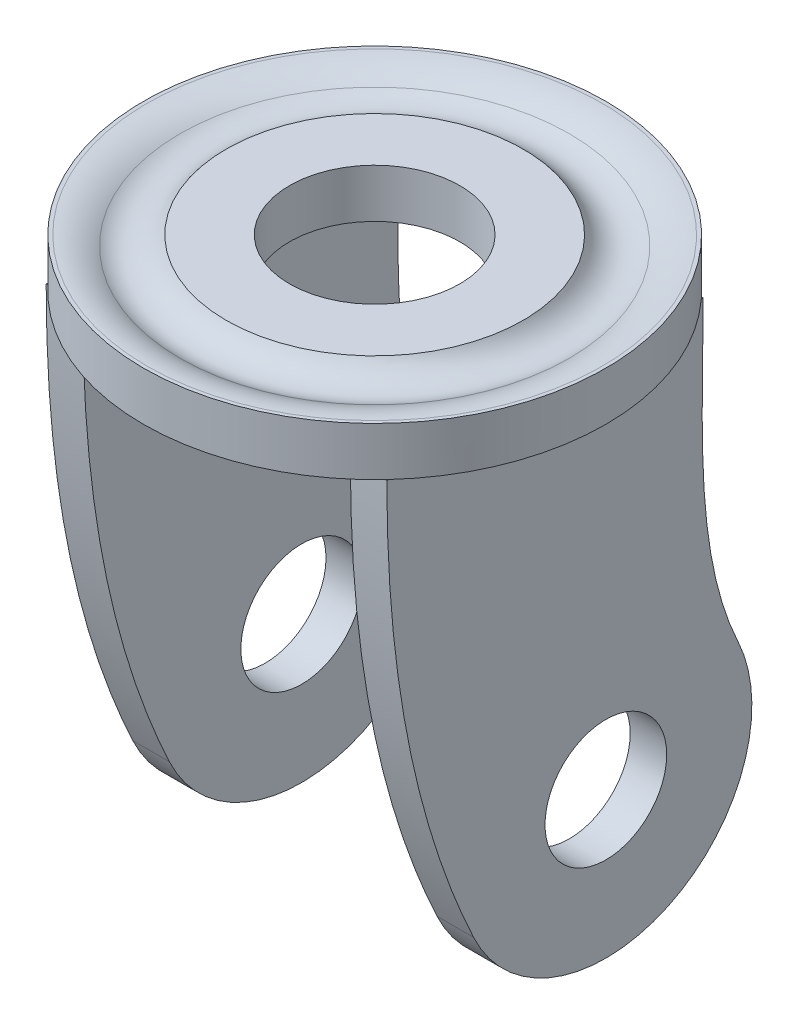
ISO-10303-21;
HEADER;
FILE_DESCRIPTION(('STEP AP214'),'2;1');
FILE_NAME('part.step','',(''),(''),'','','');
FILE_SCHEMA(('AUTOMOTIVE_DESIGN { 1 0 10303 214 1 1 1 1 }'));
ENDSEC;
DATA;
#1=APPLICATION_CONTEXT('core data for automotive mechanical design processes');
#2=APPLICATION_PROTOCOL_DEFINITION('international standard','automotive_design',2000,#1);
#3=PRODUCT_CONTEXT('',#1,'mechanical');
#4=PRODUCT('Part','Part','',(#3));
#5=PRODUCT_RELATED_PRODUCT_CATEGORY('part','',(#4));
#6=PRODUCT_DEFINITION_FORMATION('','',#4);
#7=PRODUCT_DEFINITION_CONTEXT('part definition',#1,'design');
#8=PRODUCT_DEFINITION('design','',#6,#7);
#9=PRODUCT_DEFINITION_SHAPE('','',#8);
#10=(LENGTH_UNIT() NAMED_UNIT(*) SI_UNIT(.MILLI.,.METRE.));
#11=(NAMED_UNIT(*) PLANE_ANGLE_UNIT() SI_UNIT($,.RADIAN.));
#12=(NAMED_UNIT(*) SI_UNIT($,.STERADIAN.) SOLID_ANGLE_UNIT());
#13=UNCERTAINTY_MEASURE_WITH_UNIT(LENGTH_MEASURE(1.E-05),#10,'distance_accuracy_value','');
#14=(GEOMETRIC_REPRESENTATION_CONTEXT(3) GLOBAL_UNCERTAINTY_ASSIGNED_CONTEXT((#13)) GLOBAL_UNIT_ASSIGNED_CONTEXT((#10,
#11,#12)) REPRESENTATION_CONTEXT('',''));
#15=CARTESIAN_POINT('',(0.,0.,0.));
#16=DIRECTION('',(0.,0.,1.));
#17=DIRECTION('',(1.,0.,0.));
#18=AXIS2_PLACEMENT_3D('',#15,#16,#17);
#19=CARTESIAN_POINT('',(-7.,0.,0.));
#20=DIRECTION('',(0.,-1.,0.));
#21=DIRECTION('',(0.,0.,-1.));
#22=AXIS2_PLACEMENT_3D('',#19,#20,#21);
#23=PLANE('',#22);
#24=CARTESIAN_POINT('',(0.,0.,0.));
#25=DIRECTION('',(0.,1.,0.));
#26=DIRECTION('',(0.,0.,1.));
#27=AXIS2_PLACEMENT_3D('',#24,#25,#26);
#28=CIRCLE('',#27,19.);
#29=CARTESIAN_POINT('',(14.,0.,12.8452325786651));
#30=VERTEX_POINT('',#29);
#31=CARTESIAN_POINT('',(14.,0.,-12.8452325786651));
#32=VERTEX_POINT('',#31);
#33=EDGE_CURVE('E362',#30,#32,#28,.T.);
#34=ORIENTED_EDGE('',*,*,#33,.F.);
#35=DIRECTION('',(0.,0.,1.));
#36=VECTOR('',#35,1.);
#37=CARTESIAN_POINT('',(14.,0.,-13.));
#38=LINE('',#37,#36);
#39=EDGE_CURVE('E508',#32,#30,#38,.T.);
#40=ORIENTED_EDGE('',*,*,#39,.F.);
#41=EDGE_LOOP('',(#34,#40));
#42=FACE_BOUND('',#41,.T.);
#43=ADVANCED_FACE('F39',(#42),#23,.T.);
#44=CARTESIAN_POINT('',(0.,0.,0.));
#45=DIRECTION('',(0.,1.,0.));
#46=DIRECTION('',(0.,0.,1.));
#47=AXIS2_PLACEMENT_3D('',#44,#45,#46);
#48=CIRCLE('',#47,7.);
#49=CARTESIAN_POINT('',(0.,0.,7.));
#50=VERTEX_POINT('',#49);
#51=EDGE_CURVE('E281',#50,#50,#48,.T.);
#52=ORIENTED_EDGE('',*,*,#51,.T.);
#53=EDGE_LOOP('',(#52));
#54=FACE_BOUND('',#53,.T.);
#55=CARTESIAN_POINT('',(13.856406460551,0.,-13.));
#56=VERTEX_POINT('',#55);
#57=CARTESIAN_POINT('',(-13.856406460551,0.,-13.));
#58=VERTEX_POINT('',#57);
#59=EDGE_CURVE('E276',#56,#58,#28,.T.);
#60=ORIENTED_EDGE('',*,*,#59,.F.);
#61=DIRECTION('',(-1.,0.,0.));
#62=VECTOR('',#61,1.);
#63=CARTESIAN_POINT('',(14.,0.,-13.));
#64=LINE('',#63,#62);
#65=CARTESIAN_POINT('',(11.,0.,-13.));
#66=VERTEX_POINT('',#65);
#67=EDGE_CURVE('E354',#56,#66,#64,.T.);
#68=ORIENTED_EDGE('',*,*,#67,.T.);
#69=DIRECTION('',(0.,0.,1.));
#70=VECTOR('',#69,1.);
#71=CARTESIAN_POINT('',(11.,0.,-13.));
#72=LINE('',#71,#70);
#73=CARTESIAN_POINT('',(11.,0.,13.));
#74=VERTEX_POINT('',#73);
#75=EDGE_CURVE('E159',#66,#74,#72,.T.);
#76=ORIENTED_EDGE('',*,*,#75,.T.);
#77=DIRECTION('',(-1.,0.,0.));
#78=VECTOR('',#77,1.);
#79=CARTESIAN_POINT('',(14.,0.,13.));
#80=LINE('',#79,#78);
#81=CARTESIAN_POINT('',(13.856406460551,0.,13.));
#82=VERTEX_POINT('',#81);
#83=EDGE_CURVE('E533',#82,#74,#80,.T.);
#84=ORIENTED_EDGE('',*,*,#83,.F.);
#85=CARTESIAN_POINT('',(-13.856406460551,0.,13.));
#86=VERTEX_POINT('',#85);
#87=EDGE_CURVE('E367',#86,#82,#28,.T.);
#88=ORIENTED_EDGE('',*,*,#87,.F.);
#89=DIRECTION('',(1.,0.,0.));
#90=VECTOR('',#89,1.);
#91=CARTESIAN_POINT('',(-14.,0.,13.));
#92=LINE('',#91,#90);
#93=CARTESIAN_POINT('',(-11.,0.,13.));
#94=VERTEX_POINT('',#93);
#95=EDGE_CURVE('E260',#86,#94,#92,.T.);
#96=ORIENTED_EDGE('',*,*,#95,.T.);
#97=DIRECTION('',(0.,0.,1.));
#98=VECTOR('',#97,1.);
#99=CARTESIAN_POINT('',(-11.,0.,-13.));
#100=LINE('',#99,#98);
#101=CARTESIAN_POINT('',(-11.,0.,-13.));
#102=VERTEX_POINT('',#101);
#103=EDGE_CURVE('E63',#102,#94,#100,.T.);
#104=ORIENTED_EDGE('',*,*,#103,.F.);
#105=DIRECTION('',(1.,0.,0.));
#106=VECTOR('',#105,1.);
#107=CARTESIAN_POINT('',(-14.,0.,-13.));
#108=LINE('',#107,#106);
#109=EDGE_CURVE('E264',#58,#102,#108,.T.);
#110=ORIENTED_EDGE('',*,*,#109,.F.);
#111=EDGE_LOOP('',(#60,#68,#76,#84,#88,#96,#104,#110));
#112=FACE_BOUND('',#111,.T.);
#113=ADVANCED_FACE('F336',(#54,#112),#23,.T.);
#114=CARTESIAN_POINT('',(-14.,0.,-12.8452325786651));
#115=VERTEX_POINT('',#114);
#116=CARTESIAN_POINT('',(-14.,0.,12.8452325786651));
#117=VERTEX_POINT('',#116);
#118=EDGE_CURVE('E282',#115,#117,#28,.T.);
#119=ORIENTED_EDGE('',*,*,#118,.F.);
#120=DIRECTION('',(0.,0.,1.));
#121=VECTOR('',#120,1.);
#122=CARTESIAN_POINT('',(-14.,0.,-13.));
#123=LINE('',#122,#121);
#124=EDGE_CURVE('E287',#115,#117,#123,.T.);
#125=ORIENTED_EDGE('',*,*,#124,.T.);
#126=EDGE_LOOP('',(#119,#125));
#127=FACE_BOUND('',#126,.T.);
#128=ADVANCED_FACE('F338',(#127),#23,.T.);
#129=CARTESIAN_POINT('',(0.,8.36916334889666,0.));
#130=DIRECTION('',(0.,1.,0.));
#131=DIRECTION('',(0.,0.,1.));
#132=AXIS2_PLACEMENT_3D('',#129,#130,#131);
#133=CYLINDRICAL_SURFACE('',#132,7.);
#134=CARTESIAN_POINT('',(0.,4.,0.));
#135=DIRECTION('',(0.,1.,0.));
#136=DIRECTION('',(0.,0.,1.));
#137=AXIS2_PLACEMENT_3D('',#134,#135,#136);
#138=CIRCLE('',#137,7.);
#139=CARTESIAN_POINT('',(0.,4.,7.));
#140=VERTEX_POINT('',#139);
#141=EDGE_CURVE('E252',#140,#140,#138,.T.);
#142=ORIENTED_EDGE('',*,*,#141,.T.);
#143=EDGE_LOOP('',(#142));
#144=FACE_BOUND('',#143,.T.);
#145=ORIENTED_EDGE('',*,*,#51,.F.);
#146=EDGE_LOOP('',(#145));
#147=FACE_BOUND('',#146,.T.);
#148=ADVANCED_FACE('F333',(#144,#147),#133,.F.);
#149=CARTESIAN_POINT('',(0.,8.36916334889666,0.));
#150=DIRECTION('',(0.,1.,0.));
#151=DIRECTION('',(0.,0.,1.));
#152=AXIS2_PLACEMENT_3D('',#149,#150,#151);
#153=CYLINDRICAL_SURFACE('',#152,19.);
#154=EDGE_CURVE('E277',#58,#115,#28,.T.);
#155=ORIENTED_EDGE('',*,*,#154,.T.);
#156=ORIENTED_EDGE('',*,*,#118,.T.);
#157=EDGE_CURVE('E370',#117,#86,#28,.T.);
#158=ORIENTED_EDGE('',*,*,#157,.T.);
#159=ORIENTED_EDGE('',*,*,#87,.T.);
#160=EDGE_CURVE('E365',#82,#30,#28,.T.);
#161=ORIENTED_EDGE('',*,*,#160,.T.);
#162=ORIENTED_EDGE('',*,*,#33,.T.);
#163=EDGE_CURVE('E357',#32,#56,#28,.T.);
#164=ORIENTED_EDGE('',*,*,#163,.T.);
#165=ORIENTED_EDGE('',*,*,#59,.T.);
#166=EDGE_LOOP('',(#155,#156,#158,#159,#161,#162,#164,#165));
#167=FACE_BOUND('',#166,.T.);
#168=CARTESIAN_POINT('',(0.,4.,0.));
#169=DIRECTION('',(0.,1.,0.));
#170=DIRECTION('',(0.,0.,1.));
#171=AXIS2_PLACEMENT_3D('',#168,#169,#170);
#172=CIRCLE('',#171,19.);
#173=CARTESIAN_POINT('',(0.,4.,19.));
#174=VERTEX_POINT('',#173);
#175=EDGE_CURVE('E272',#174,#174,#172,.T.);
#176=ORIENTED_EDGE('',*,*,#175,.F.);
#177=EDGE_LOOP('',(#176));
#178=FACE_BOUND('',#177,.T.);
#179=ADVANCED_FACE('F329',(#167,#178),#153,.T.);
#180=CARTESIAN_POINT('',(-16.8,4.,0.));
#181=DIRECTION('',(0.,1.,0.));
#182=DIRECTION('',(0.,0.,1.));
#183=AXIS2_PLACEMENT_3D('',#180,#181,#182);
#184=PLANE('',#183);
#185=CARTESIAN_POINT('',(0.,4.,0.));
#186=DIRECTION('',(0.,1.,0.));
#187=DIRECTION('',(0.,0.,1.));
#188=AXIS2_PLACEMENT_3D('',#185,#186,#187);
#189=CIRCLE('',#188,18.7089412645366);
#190=CARTESIAN_POINT('',(0.,4.,18.7089412645366));
#191=VERTEX_POINT('',#190);
#192=EDGE_CURVE('E11',#191,#191,#189,.F.);
#193=ORIENTED_EDGE('',*,*,#192,.T.);
#194=EDGE_LOOP('',(#193));
#195=FACE_BOUND('',#194,.T.);
#196=ORIENTED_EDGE('',*,*,#175,.T.);
#197=EDGE_LOOP('',(#196));
#198=FACE_BOUND('',#197,.T.);
#199=ADVANCED_FACE('F326',(#195,#198),#184,.T.);
#200=CARTESIAN_POINT('',(0.,5.50748134316813,0.));
#201=DIRECTION('',(0.,1.,0.));
#202=DIRECTION('',(0.,0.,1.));
#203=AXIS2_PLACEMENT_3D('',#200,#201,#202);
#204=TOROIDAL_SURFACE('',#203,14.5,2.75);
#205=CARTESIAN_POINT('',(0.,3.19837506010847,0.));
#206=DIRECTION('',(0.,1.,0.));
#207=DIRECTION('',(0.,0.,1.));
#208=AXIS2_PLACEMENT_3D('',#205,#206,#207);
#209=CIRCLE('',#208,15.9934952874162);
#210=CARTESIAN_POINT('',(0.,3.19837506010847,15.9934952874162));
#211=VERTEX_POINT('',#210);
#212=EDGE_CURVE('E48',#211,#211,#209,.T.);
#213=ORIENTED_EDGE('',*,*,#212,.T.);
#214=EDGE_LOOP('',(#213));
#215=FACE_BOUND('',#214,.T.);
#216=CARTESIAN_POINT('',(0.,4.,0.));
#217=DIRECTION('',(0.,1.,0.));
#218=DIRECTION('',(0.,0.,1.));
#219=AXIS2_PLACEMENT_3D('',#216,#217,#218);
#220=CIRCLE('',#219,12.2);
#221=CARTESIAN_POINT('',(0.,4.,12.2));
#222=VERTEX_POINT('',#221);
#223=EDGE_CURVE('E268',#222,#222,#220,.T.);
#224=ORIENTED_EDGE('',*,*,#223,.F.);
#225=EDGE_LOOP('',(#224));
#226=FACE_BOUND('',#225,.T.);
#227=ADVANCED_FACE('F322',(#215,#226),#204,.F.);
#228=CARTESIAN_POINT('',(-7.,4.,0.));
#229=DIRECTION('',(0.,1.,0.));
#230=DIRECTION('',(0.,0.,1.));
#231=AXIS2_PLACEMENT_3D('',#228,#229,#230);
#232=PLANE('',#231);
#233=ORIENTED_EDGE('',*,*,#223,.T.);
#234=EDGE_LOOP('',(#233));
#235=FACE_BOUND('',#234,.T.);
#236=ORIENTED_EDGE('',*,*,#141,.F.);
#237=EDGE_LOOP('',(#236));
#238=FACE_BOUND('',#237,.T.);
#239=ADVANCED_FACE('F319',(#235,#238),#232,.T.);
#240=CARTESIAN_POINT('',(-14.,0.,-13.));
#241=DIRECTION('',(0.,1.,0.));
#242=DIRECTION('',(0.,0.,1.));
#243=AXIS2_PLACEMENT_3D('',#240,#241,#242);
#244=PLANE('',#243);
#245=ORIENTED_EDGE('',*,*,#154,.F.);
#246=CARTESIAN_POINT('',(-14.,0.,-13.));
#247=VERTEX_POINT('',#246);
#248=EDGE_CURVE('E224',#247,#58,#108,.T.);
#249=ORIENTED_EDGE('',*,*,#248,.F.);
#250=EDGE_CURVE('E216',#247,#115,#123,.T.);
#251=ORIENTED_EDGE('',*,*,#250,.T.);
#252=EDGE_LOOP('',(#245,#249,#251));
#253=FACE_BOUND('',#252,.T.);
#254=ADVANCED_FACE('F205',(#253),#244,.T.);
#255=ORIENTED_EDGE('',*,*,#157,.F.);
#256=CARTESIAN_POINT('',(-14.,0.,13.));
#257=VERTEX_POINT('',#256);
#258=EDGE_CURVE('E292',#117,#257,#123,.T.);
#259=ORIENTED_EDGE('',*,*,#258,.T.);
#260=EDGE_CURVE('E256',#257,#86,#92,.T.);
#261=ORIENTED_EDGE('',*,*,#260,.T.);
#262=EDGE_LOOP('',(#255,#259,#261));
#263=FACE_BOUND('',#262,.T.);
#264=ADVANCED_FACE('F318',(#263),#244,.T.);
#265=CARTESIAN_POINT('',(-14.,-25.9285808591116,-15.8756934444398));
#266=CARTESIAN_POINT('',(-14.,-17.9519813250211,-12.1561439956578));
#267=CARTESIAN_POINT('',(-14.,-8.69585417281567,-13.));
#268=CARTESIAN_POINT('',(-14.,0.,-13.));
#269=B_SPLINE_CURVE_WITH_KNOTS('',3,(#265,#266,#267,#268),.UNSPECIFIED.,.F.,.F.,(4,4),(0.,1.),.UNSPECIFIED.);
#270=DIRECTION('',(1.,0.,0.));
#271=VECTOR('',#270,1.);
#272=SURFACE_OF_LINEAR_EXTRUSION('',#269,#271);
#273=CARTESIAN_POINT('',(-11.,-25.9285808591116,-15.8756934444398));
#274=CARTESIAN_POINT('',(-11.,-17.9519813250211,-12.1561439956578));
#275=CARTESIAN_POINT('',(-11.,-8.69585417281567,-13.));
#276=CARTESIAN_POINT('',(-11.,0.,-13.));
#277=B_SPLINE_CURVE_WITH_KNOTS('',3,(#273,#274,#275,#276),.UNSPECIFIED.,.F.,.F.,(4,4),(0.,1.),.UNSPECIFIED.);
#278=CARTESIAN_POINT('',(-11.,-25.9285808591116,-15.8756934444398));
#279=VERTEX_POINT('',#278);
#280=EDGE_CURVE('E225',#279,#102,#277,.T.);
#281=ORIENTED_EDGE('',*,*,#280,.F.);
#282=DIRECTION('',(1.,0.,0.));
#283=VECTOR('',#282,1.);
#284=CARTESIAN_POINT('',(-14.,-25.9285808591116,-15.8756934444398));
#285=LINE('',#284,#283);
#286=CARTESIAN_POINT('',(-14.,-25.9285808591116,-15.8756934444398));
#287=VERTEX_POINT('',#286);
#288=EDGE_CURVE('E249',#287,#279,#285,.T.);
#289=ORIENTED_EDGE('',*,*,#288,.F.);
#290=EDGE_CURVE('E248',#287,#247,#269,.T.);
#291=ORIENTED_EDGE('',*,*,#290,.T.);
#292=ORIENTED_EDGE('',*,*,#248,.T.);
#293=ORIENTED_EDGE('',*,*,#109,.T.);
#294=EDGE_LOOP('',(#281,#289,#291,#292,#293));
#295=FACE_BOUND('',#294,.T.);
#296=ADVANCED_FACE('F199',(#295),#272,.T.);
#297=CARTESIAN_POINT('',(-14.,-31.,-5.00000000000001));
#298=DIRECTION('',(1.,0.,0.));
#299=DIRECTION('',(0.,0.,-1.));
#300=AXIS2_PLACEMENT_3D('',#297,#298,#299);
#301=CYLINDRICAL_SURFACE('',#300,12.);
#302=CARTESIAN_POINT('',(-11.,-31.,-5.00000000000001));
#303=DIRECTION('',(1.,0.,0.));
#304=DIRECTION('',(0.,0.,1.));
#305=AXIS2_PLACEMENT_3D('',#302,#303,#304);
#306=CIRCLE('',#305,12.);
#307=CARTESIAN_POINT('',(-11.,-36.0714191408884,5.87569344443978));
#308=VERTEX_POINT('',#307);
#309=EDGE_CURVE('E241',#308,#279,#306,.T.);
#310=ORIENTED_EDGE('',*,*,#309,.F.);
#311=DIRECTION('',(1.,0.,0.));
#312=VECTOR('',#311,1.);
#313=CARTESIAN_POINT('',(-14.,-36.0714191408884,5.87569344443978));
#314=LINE('',#313,#312);
#315=CARTESIAN_POINT('',(-14.,-36.0714191408884,5.87569344443978));
#316=VERTEX_POINT('',#315);
#317=EDGE_CURVE('E253',#316,#308,#314,.T.);
#318=ORIENTED_EDGE('',*,*,#317,.F.);
#319=CARTESIAN_POINT('',(-14.,-31.,-5.00000000000001));
#320=DIRECTION('',(1.,0.,0.));
#321=DIRECTION('',(0.,0.,1.));
#322=AXIS2_PLACEMENT_3D('',#319,#320,#321);
#323=CIRCLE('',#322,12.);
#324=EDGE_CURVE('E215',#316,#287,#323,.T.);
#325=ORIENTED_EDGE('',*,*,#324,.T.);
#326=ORIENTED_EDGE('',*,*,#288,.T.);
#327=EDGE_LOOP('',(#310,#318,#325,#326));
#328=FACE_BOUND('',#327,.T.);
#329=ADVANCED_FACE('F196',(#328),#301,.T.);
#330=CARTESIAN_POINT('',(-14.,0.,13.));
#331=CARTESIAN_POINT('',(-14.,-12.2560779603666,13.));
#332=CARTESIAN_POINT('',(-14.,-24.5503113062907,11.2480742581423));
#333=CARTESIAN_POINT('',(-14.,-36.0714191408884,5.87569344443978));
#334=B_SPLINE_CURVE_WITH_KNOTS('',3,(#330,#331,#332,#333),.UNSPECIFIED.,.F.,.F.,(4,4),(0.,1.),.UNSPECIFIED.);
#335=DIRECTION('',(1.,0.,0.));
#336=VECTOR('',#335,1.);
#337=SURFACE_OF_LINEAR_EXTRUSION('',#334,#336);
#338=CARTESIAN_POINT('',(-11.,0.,13.));
#339=CARTESIAN_POINT('',(-11.,-12.2560779603666,13.));
#340=CARTESIAN_POINT('',(-11.,-24.5503113062907,11.2480742581423));
#341=CARTESIAN_POINT('',(-11.,-36.0714191408884,5.87569344443978));
#342=B_SPLINE_CURVE_WITH_KNOTS('',3,(#338,#339,#340,#341),.UNSPECIFIED.,.F.,.F.,(4,4),(0.,1.),.UNSPECIFIED.);
#343=EDGE_CURVE('E236',#94,#308,#342,.T.);
#344=ORIENTED_EDGE('',*,*,#343,.F.);
#345=ORIENTED_EDGE('',*,*,#95,.F.);
#346=ORIENTED_EDGE('',*,*,#260,.F.);
#347=EDGE_CURVE('E207',#257,#316,#334,.T.);
#348=ORIENTED_EDGE('',*,*,#347,.T.);
#349=ORIENTED_EDGE('',*,*,#317,.T.);
#350=EDGE_LOOP('',(#344,#345,#346,#348,#349));
#351=FACE_BOUND('',#350,.T.);
#352=ADVANCED_FACE('F191',(#351),#337,.T.);
#353=CARTESIAN_POINT('',(-14.,-13.2340109190777,-13.0430156789266));
#354=DIRECTION('',(1.,0.,0.));
#355=DIRECTION('',(0.,0.,-1.));
#356=AXIS2_PLACEMENT_3D('',#353,#354,#355);
#357=PLANE('',#356);
#358=CARTESIAN_POINT('',(-14.,-31.,-5.00000000000001));
#359=DIRECTION('',(1.,0.,0.));
#360=DIRECTION('',(0.,0.,-1.));
#361=AXIS2_PLACEMENT_3D('',#358,#359,#360);
#362=CIRCLE('',#361,5.);
#363=CARTESIAN_POINT('',(-14.,-31.,-10.));
#364=VERTEX_POINT('',#363);
#365=EDGE_CURVE('E230',#364,#364,#362,.T.);
#366=ORIENTED_EDGE('',*,*,#365,.T.);
#367=EDGE_LOOP('',(#366));
#368=FACE_BOUND('',#367,.T.);
#369=ORIENTED_EDGE('',*,*,#290,.F.);
#370=ORIENTED_EDGE('',*,*,#324,.F.);
#371=ORIENTED_EDGE('',*,*,#347,.F.);
#372=ORIENTED_EDGE('',*,*,#258,.F.);
#373=ORIENTED_EDGE('',*,*,#124,.F.);
#374=ORIENTED_EDGE('',*,*,#250,.F.);
#375=EDGE_LOOP('',(#369,#370,#371,#372,#373,#374));
#376=FACE_BOUND('',#375,.T.);
#377=ADVANCED_FACE('F188',(#368,#376),#357,.F.);
#378=CARTESIAN_POINT('',(-11.,-13.2340109190777,-13.0430156789266));
#379=DIRECTION('',(1.,0.,0.));
#380=DIRECTION('',(0.,0.,-1.));
#381=AXIS2_PLACEMENT_3D('',#378,#379,#380);
#382=PLANE('',#381);
#383=CARTESIAN_POINT('',(-11.,-31.,-5.00000000000001));
#384=DIRECTION('',(1.,0.,0.));
#385=DIRECTION('',(0.,0.,-1.));
#386=AXIS2_PLACEMENT_3D('',#383,#384,#385);
#387=CIRCLE('',#386,5.);
#388=CARTESIAN_POINT('',(-11.,-31.,-10.));
#389=VERTEX_POINT('',#388);
#390=EDGE_CURVE('E311',#389,#389,#387,.T.);
#391=ORIENTED_EDGE('',*,*,#390,.F.);
#392=EDGE_LOOP('',(#391));
#393=FACE_BOUND('',#392,.T.);
#394=ORIENTED_EDGE('',*,*,#280,.T.);
#395=ORIENTED_EDGE('',*,*,#103,.T.);
#396=ORIENTED_EDGE('',*,*,#343,.T.);
#397=ORIENTED_EDGE('',*,*,#309,.T.);
#398=EDGE_LOOP('',(#394,#395,#396,#397));
#399=FACE_BOUND('',#398,.T.);
#400=ADVANCED_FACE('F186',(#393,#399),#382,.T.);
#401=CARTESIAN_POINT('',(-14.,-31.,-5.00000000000001));
#402=DIRECTION('',(1.,0.,0.));
#403=DIRECTION('',(0.,0.,-1.));
#404=AXIS2_PLACEMENT_3D('',#401,#402,#403);
#405=CYLINDRICAL_SURFACE('',#404,5.);
#406=ORIENTED_EDGE('',*,*,#365,.F.);
#407=EDGE_LOOP('',(#406));
#408=FACE_BOUND('',#407,.T.);
#409=ORIENTED_EDGE('',*,*,#390,.T.);
#410=EDGE_LOOP('',(#409));
#411=FACE_BOUND('',#410,.T.);
#412=ADVANCED_FACE('F182',(#408,#411),#405,.F.);
#413=CARTESIAN_POINT('',(14.,0.,-13.));
#414=DIRECTION('',(0.,-1.,0.));
#415=DIRECTION('',(0.,0.,-1.));
#416=AXIS2_PLACEMENT_3D('',#413,#414,#415);
#417=PLANE('',#416);
#418=ORIENTED_EDGE('',*,*,#160,.F.);
#419=CARTESIAN_POINT('',(14.,0.,13.));
#420=VERTEX_POINT('',#419);
#421=EDGE_CURVE('E529',#420,#82,#80,.T.);
#422=ORIENTED_EDGE('',*,*,#421,.F.);
#423=EDGE_CURVE('E502',#30,#420,#38,.T.);
#424=ORIENTED_EDGE('',*,*,#423,.F.);
#425=EDGE_LOOP('',(#418,#422,#424));
#426=FACE_BOUND('',#425,.T.);
#427=ADVANCED_FACE('F185',(#426),#417,.F.);
#428=CARTESIAN_POINT('',(14.,-13.2340109190777,-13.0430156789266));
#429=DIRECTION('',(-1.,0.,0.));
#430=DIRECTION('',(0.,0.,-1.));
#431=AXIS2_PLACEMENT_3D('',#428,#429,#430);
#432=PLANE('',#431);
#433=CARTESIAN_POINT('',(14.,-25.9285808591116,-15.8756934444398));
#434=CARTESIAN_POINT('',(14.,-17.9519813250211,-12.1561439956578));
#435=CARTESIAN_POINT('',(14.,-8.69585417281567,-13.));
#436=CARTESIAN_POINT('',(14.,0.,-13.));
#437=B_SPLINE_CURVE_WITH_KNOTS('',3,(#433,#434,#435,#436),.UNSPECIFIED.,.F.,.F.,(4,4),(0.,1.),.UNSPECIFIED.);
#438=CARTESIAN_POINT('',(14.,-25.9285808591116,-15.8756934444398));
#439=VERTEX_POINT('',#438);
#440=CARTESIAN_POINT('',(14.,0.,-13.));
#441=VERTEX_POINT('',#440);
#442=EDGE_CURVE('E137',#439,#441,#437,.T.);
#443=ORIENTED_EDGE('',*,*,#442,.T.);
#444=EDGE_CURVE('E155',#441,#32,#38,.T.);
#445=ORIENTED_EDGE('',*,*,#444,.T.);
#446=ORIENTED_EDGE('',*,*,#39,.T.);
#447=ORIENTED_EDGE('',*,*,#423,.T.);
#448=CARTESIAN_POINT('',(14.,0.,13.));
#449=CARTESIAN_POINT('',(14.,-12.2560779603666,13.));
#450=CARTESIAN_POINT('',(14.,-24.5503113062907,11.2480742581423));
#451=CARTESIAN_POINT('',(14.,-36.0714191408884,5.87569344443978));
#452=B_SPLINE_CURVE_WITH_KNOTS('',3,(#448,#449,#450,#451),.UNSPECIFIED.,.F.,.F.,(4,4),(0.,1.),.UNSPECIFIED.);
#453=CARTESIAN_POINT('',(14.,-36.0714191408884,5.87569344443978));
#454=VERTEX_POINT('',#453);
#455=EDGE_CURVE('E139',#420,#454,#452,.T.);
#456=ORIENTED_EDGE('',*,*,#455,.T.);
#457=CARTESIAN_POINT('',(14.,-31.,-5.00000000000001));
#458=DIRECTION('',(1.,0.,0.));
#459=DIRECTION('',(0.,0.,1.));
#460=AXIS2_PLACEMENT_3D('',#457,#458,#459);
#461=CIRCLE('',#460,12.);
#462=EDGE_CURVE('E131',#454,#439,#461,.T.);
#463=ORIENTED_EDGE('',*,*,#462,.T.);
#464=EDGE_LOOP('',(#443,#445,#446,#447,#456,#463));
#465=FACE_BOUND('',#464,.T.);
#466=CARTESIAN_POINT('',(14.,-31.,-5.00000000000001));
#467=DIRECTION('',(1.,0.,0.));
#468=DIRECTION('',(0.,0.,-1.));
#469=AXIS2_PLACEMENT_3D('',#466,#467,#468);
#470=CIRCLE('',#469,5.);
#471=CARTESIAN_POINT('',(14.,-31.,-10.));
#472=VERTEX_POINT('',#471);
#473=EDGE_CURVE('E514',#472,#472,#470,.T.);
#474=ORIENTED_EDGE('',*,*,#473,.F.);
#475=EDGE_LOOP('',(#474));
#476=FACE_BOUND('',#475,.T.);
#477=ADVANCED_FACE('F133',(#465,#476),#432,.F.);
#478=CARTESIAN_POINT('',(11.,-13.2340109190777,-13.0430156789266));
#479=DIRECTION('',(-1.,0.,0.));
#480=DIRECTION('',(0.,0.,-1.));
#481=AXIS2_PLACEMENT_3D('',#478,#479,#480);
#482=PLANE('',#481);
#483=CARTESIAN_POINT('',(11.,-25.9285808591116,-15.8756934444398));
#484=CARTESIAN_POINT('',(11.,-17.9519813250211,-12.1561439956578));
#485=CARTESIAN_POINT('',(11.,-8.69585417281567,-13.));
#486=CARTESIAN_POINT('',(11.,0.,-13.));
#487=B_SPLINE_CURVE_WITH_KNOTS('',3,(#483,#484,#485,#486),.UNSPECIFIED.,.F.,.F.,(4,4),(0.,1.),.UNSPECIFIED.);
#488=CARTESIAN_POINT('',(11.,-25.9285808591116,-15.8756934444398));
#489=VERTEX_POINT('',#488);
#490=EDGE_CURVE('E509',#489,#66,#487,.T.);
#491=ORIENTED_EDGE('',*,*,#490,.F.);
#492=CARTESIAN_POINT('',(11.,-31.,-5.00000000000001));
#493=DIRECTION('',(1.,0.,0.));
#494=DIRECTION('',(0.,0.,1.));
#495=AXIS2_PLACEMENT_3D('',#492,#493,#494);
#496=CIRCLE('',#495,12.);
#497=CARTESIAN_POINT('',(11.,-36.0714191408884,5.87569344443978));
#498=VERTEX_POINT('',#497);
#499=EDGE_CURVE('E149',#498,#489,#496,.T.);
#500=ORIENTED_EDGE('',*,*,#499,.F.);
#501=CARTESIAN_POINT('',(11.,0.,13.));
#502=CARTESIAN_POINT('',(11.,-12.2560779603666,13.));
#503=CARTESIAN_POINT('',(11.,-24.5503113062907,11.2480742581423));
#504=CARTESIAN_POINT('',(11.,-36.0714191408884,5.87569344443978));
#505=B_SPLINE_CURVE_WITH_KNOTS('',3,(#501,#502,#503,#504),.UNSPECIFIED.,.F.,.F.,(4,4),(0.,1.),.UNSPECIFIED.);
#506=EDGE_CURVE('E163',#74,#498,#505,.T.);
#507=ORIENTED_EDGE('',*,*,#506,.F.);
#508=ORIENTED_EDGE('',*,*,#75,.F.);
#509=EDGE_LOOP('',(#491,#500,#507,#508));
#510=FACE_BOUND('',#509,.T.);
#511=CARTESIAN_POINT('',(11.,-31.,-5.00000000000001));
#512=DIRECTION('',(1.,0.,0.));
#513=DIRECTION('',(0.,0.,-1.));
#514=AXIS2_PLACEMENT_3D('',#511,#512,#513);
#515=CIRCLE('',#514,5.);
#516=CARTESIAN_POINT('',(11.,-31.,-10.));
#517=VERTEX_POINT('',#516);
#518=EDGE_CURVE('E169',#517,#517,#515,.T.);
#519=ORIENTED_EDGE('',*,*,#518,.T.);
#520=EDGE_LOOP('',(#519));
#521=FACE_BOUND('',#520,.T.);
#522=ADVANCED_FACE('F180',(#510,#521),#482,.T.);
#523=DIRECTION('',(-1.,0.,0.));
#524=VECTOR('',#523,1.);
#525=SURFACE_OF_LINEAR_EXTRUSION('',#437,#524);
#526=ORIENTED_EDGE('',*,*,#490,.T.);
#527=ORIENTED_EDGE('',*,*,#67,.F.);
#528=EDGE_CURVE('E55',#441,#56,#64,.T.);
#529=ORIENTED_EDGE('',*,*,#528,.F.);
#530=ORIENTED_EDGE('',*,*,#442,.F.);
#531=DIRECTION('',(-1.,0.,0.));
#532=VECTOR('',#531,1.);
#533=CARTESIAN_POINT('',(14.,-25.9285808591116,-15.8756934444398));
#534=LINE('',#533,#532);
#535=EDGE_CURVE('E146',#439,#489,#534,.T.);
#536=ORIENTED_EDGE('',*,*,#535,.T.);
#537=EDGE_LOOP('',(#526,#527,#529,#530,#536));
#538=FACE_BOUND('',#537,.T.);
#539=ADVANCED_FACE('F157',(#538),#525,.F.);
#540=ORIENTED_EDGE('',*,*,#163,.F.);
#541=ORIENTED_EDGE('',*,*,#444,.F.);
#542=ORIENTED_EDGE('',*,*,#528,.T.);
#543=EDGE_LOOP('',(#540,#541,#542));
#544=FACE_BOUND('',#543,.T.);
#545=ADVANCED_FACE('F179',(#544),#417,.F.);
#546=DIRECTION('',(-1.,0.,0.));
#547=VECTOR('',#546,1.);
#548=SURFACE_OF_LINEAR_EXTRUSION('',#452,#547);
#549=ORIENTED_EDGE('',*,*,#506,.T.);
#550=DIRECTION('',(-1.,0.,0.));
#551=VECTOR('',#550,1.);
#552=CARTESIAN_POINT('',(14.,-36.0714191408884,5.87569344443978));
#553=LINE('',#552,#551);
#554=EDGE_CURVE('E154',#454,#498,#553,.T.);
#555=ORIENTED_EDGE('',*,*,#554,.F.);
#556=ORIENTED_EDGE('',*,*,#455,.F.);
#557=ORIENTED_EDGE('',*,*,#421,.T.);
#558=ORIENTED_EDGE('',*,*,#83,.T.);
#559=EDGE_LOOP('',(#549,#555,#556,#557,#558));
#560=FACE_BOUND('',#559,.T.);
#561=ADVANCED_FACE('F457',(#560),#548,.F.);
#562=CARTESIAN_POINT('',(14.,-31.,-5.00000000000001));
#563=DIRECTION('',(-1.,0.,0.));
#564=DIRECTION('',(0.,0.,1.));
#565=AXIS2_PLACEMENT_3D('',#562,#563,#564);
#566=CYLINDRICAL_SURFACE('',#565,12.);
#567=ORIENTED_EDGE('',*,*,#499,.T.);
#568=ORIENTED_EDGE('',*,*,#535,.F.);
#569=ORIENTED_EDGE('',*,*,#462,.F.);
#570=ORIENTED_EDGE('',*,*,#554,.T.);
#571=EDGE_LOOP('',(#567,#568,#569,#570));
#572=FACE_BOUND('',#571,.T.);
#573=ADVANCED_FACE('F147',(#572),#566,.T.);
#574=CARTESIAN_POINT('',(14.,-31.,-5.00000000000001));
#575=DIRECTION('',(-1.,0.,0.));
#576=DIRECTION('',(0.,0.,1.));
#577=AXIS2_PLACEMENT_3D('',#574,#575,#576);
#578=CYLINDRICAL_SURFACE('',#577,5.);
#579=ORIENTED_EDGE('',*,*,#473,.T.);
#580=EDGE_LOOP('',(#579));
#581=FACE_BOUND('',#580,.T.);
#582=ORIENTED_EDGE('',*,*,#518,.F.);
#583=EDGE_LOOP('',(#582));
#584=FACE_BOUND('',#583,.T.);
#585=ADVANCED_FACE('F472',(#581,#584),#578,.F.);
#586=CARTESIAN_POINT('',(0.,-1.,0.));
#587=DIRECTION('',(0.,1.,0.));
#588=DIRECTION('',(0.,0.,1.));
#589=AXIS2_PLACEMENT_3D('',#586,#587,#588);
#590=TOROIDAL_SURFACE('',#589,18.7089412645366,5.);
#591=ORIENTED_EDGE('',*,*,#192,.F.);
#592=EDGE_LOOP('',(#591));
#593=FACE_BOUND('',#592,.T.);
#594=ORIENTED_EDGE('',*,*,#212,.F.);
#595=EDGE_LOOP('',(#594));
#596=FACE_BOUND('',#595,.T.);
#597=ADVANCED_FACE('F41',(#593,#596),#590,.T.);
#598=CLOSED_SHELL('',(#43,#113,#128,#148,#179,#199,#227,#239,#254,#264,#296,#329,#352,#377,#400,
#412,#427,#477,#522,#539,#545,#561,#573,#585,#597));
#599=MANIFOLD_SOLID_BREP('B2',#598);
#600=ADVANCED_BREP_SHAPE_REPRESENTATION('',(#18,#599),#14);
#601=SHAPE_DEFINITION_REPRESENTATION(#9,#600);
ENDSEC;
END-ISO-10303-21;
